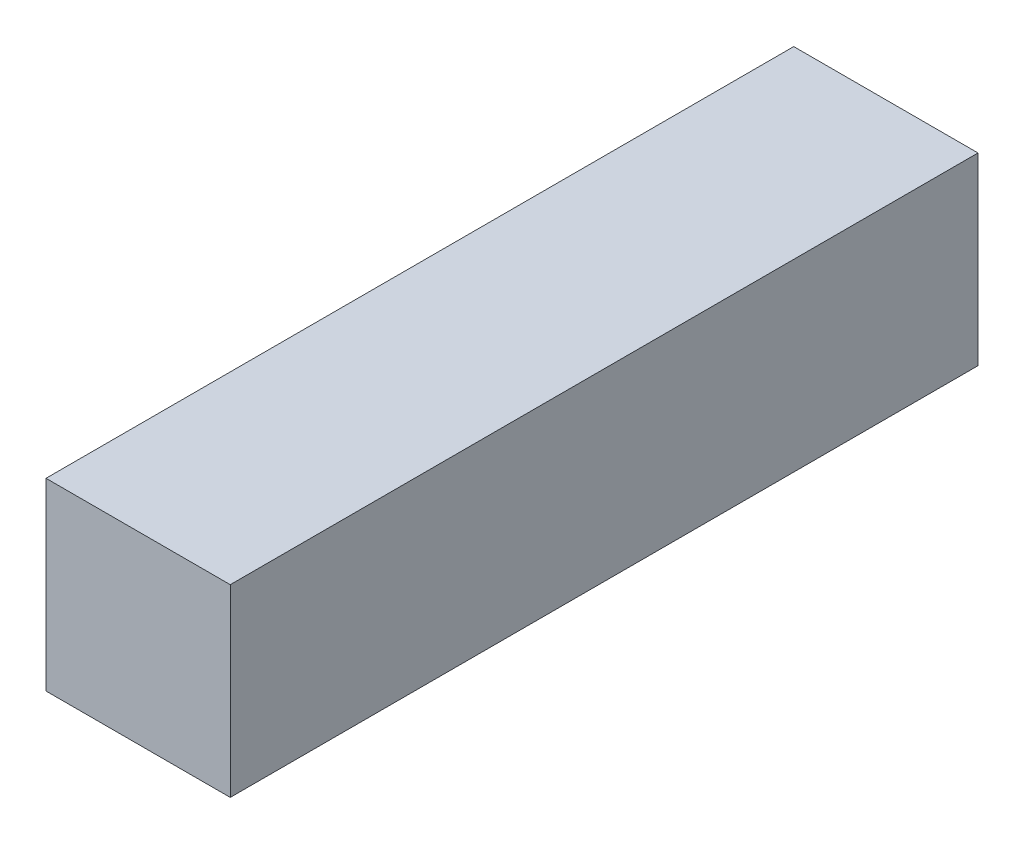
ISO-10303-21;
HEADER;
FILE_DESCRIPTION(('STEP AP214'),'2;1');
FILE_NAME('part.step','',(''),(''),'','','');
FILE_SCHEMA(('AUTOMOTIVE_DESIGN { 1 0 10303 214 1 1 1 1 }'));
ENDSEC;
DATA;
#1=APPLICATION_CONTEXT('core data for automotive mechanical design processes');
#2=APPLICATION_PROTOCOL_DEFINITION('international standard','automotive_design',2000,#1);
#3=PRODUCT_CONTEXT('',#1,'mechanical');
#4=PRODUCT('Part','Part','',(#3));
#5=PRODUCT_RELATED_PRODUCT_CATEGORY('part','',(#4));
#6=PRODUCT_DEFINITION_FORMATION('','',#4);
#7=PRODUCT_DEFINITION_CONTEXT('part definition',#1,'design');
#8=PRODUCT_DEFINITION('design','',#6,#7);
#9=PRODUCT_DEFINITION_SHAPE('','',#8);
#10=(LENGTH_UNIT() NAMED_UNIT(*) SI_UNIT(.MILLI.,.METRE.));
#11=(NAMED_UNIT(*) PLANE_ANGLE_UNIT() SI_UNIT($,.RADIAN.));
#12=(NAMED_UNIT(*) SI_UNIT($,.STERADIAN.) SOLID_ANGLE_UNIT());
#13=UNCERTAINTY_MEASURE_WITH_UNIT(LENGTH_MEASURE(1.E-05),#10,'distance_accuracy_value','');
#14=(GEOMETRIC_REPRESENTATION_CONTEXT(3) GLOBAL_UNCERTAINTY_ASSIGNED_CONTEXT((#13)) GLOBAL_UNIT_ASSIGNED_CONTEXT((#10,
#11,#12)) REPRESENTATION_CONTEXT('',''));
#15=CARTESIAN_POINT('',(0.,0.,0.));
#16=DIRECTION('',(0.,0.,1.));
#17=DIRECTION('',(1.,0.,0.));
#18=AXIS2_PLACEMENT_3D('',#15,#16,#17);
#19=CARTESIAN_POINT('',(6.35,-6.35,51.53914));
#20=DIRECTION('',(-1.,0.,0.));
#21=DIRECTION('',(0.,0.,1.));
#22=AXIS2_PLACEMENT_3D('',#19,#20,#21);
#23=PLANE('',#22);
#24=DIRECTION('',(0.,1.,0.));
#25=VECTOR('',#24,1.);
#26=CARTESIAN_POINT('',(6.35,-6.35,0.));
#27=LINE('',#26,#25);
#28=CARTESIAN_POINT('',(6.35,-6.35,0.));
#29=VERTEX_POINT('',#28);
#30=CARTESIAN_POINT('',(6.35,6.35,0.));
#31=VERTEX_POINT('',#30);
#32=EDGE_CURVE('E96',#29,#31,#27,.T.);
#33=ORIENTED_EDGE('',*,*,#32,.T.);
#34=DIRECTION('',(0.,0.,-1.));
#35=VECTOR('',#34,1.);
#36=CARTESIAN_POINT('',(6.35,6.35,51.53914));
#37=LINE('',#36,#35);
#38=CARTESIAN_POINT('',(6.35,6.35,51.53914));
#39=VERTEX_POINT('',#38);
#40=EDGE_CURVE('E11',#39,#31,#37,.T.);
#41=ORIENTED_EDGE('',*,*,#40,.F.);
#42=DIRECTION('',(0.,1.,0.));
#43=VECTOR('',#42,1.);
#44=CARTESIAN_POINT('',(6.35,-6.35,51.53914));
#45=LINE('',#44,#43);
#46=CARTESIAN_POINT('',(6.35,-6.35,51.53914));
#47=VERTEX_POINT('',#46);
#48=EDGE_CURVE('E84',#47,#39,#45,.T.);
#49=ORIENTED_EDGE('',*,*,#48,.F.);
#50=DIRECTION('',(0.,0.,-1.));
#51=VECTOR('',#50,1.);
#52=CARTESIAN_POINT('',(6.35,-6.35,51.53914));
#53=LINE('',#52,#51);
#54=EDGE_CURVE('E92',#47,#29,#53,.T.);
#55=ORIENTED_EDGE('',*,*,#54,.T.);
#56=EDGE_LOOP('',(#33,#41,#49,#55));
#57=FACE_BOUND('',#56,.T.);
#58=ADVANCED_FACE('F33',(#57),#23,.F.);
#59=CARTESIAN_POINT('',(-6.35,6.35,51.53914));
#60=DIRECTION('',(0.,-1.,0.));
#61=DIRECTION('',(0.,0.,-1.));
#62=AXIS2_PLACEMENT_3D('',#59,#60,#61);
#63=PLANE('',#62);
#64=DIRECTION('',(-1.,0.,0.));
#65=VECTOR('',#64,1.);
#66=CARTESIAN_POINT('',(-6.35,6.35,0.));
#67=LINE('',#66,#65);
#68=CARTESIAN_POINT('',(-6.35,6.35,0.));
#69=VERTEX_POINT('',#68);
#70=EDGE_CURVE('E88',#31,#69,#67,.T.);
#71=ORIENTED_EDGE('',*,*,#70,.T.);
#72=DIRECTION('',(0.,0.,-1.));
#73=VECTOR('',#72,1.);
#74=CARTESIAN_POINT('',(-6.35,6.35,51.53914));
#75=LINE('',#74,#73);
#76=CARTESIAN_POINT('',(-6.35,6.35,51.53914));
#77=VERTEX_POINT('',#76);
#78=EDGE_CURVE('E41',#77,#69,#75,.T.);
#79=ORIENTED_EDGE('',*,*,#78,.F.);
#80=DIRECTION('',(-1.,0.,0.));
#81=VECTOR('',#80,1.);
#82=CARTESIAN_POINT('',(-6.35,6.35,51.53914));
#83=LINE('',#82,#81);
#84=EDGE_CURVE('E79',#39,#77,#83,.T.);
#85=ORIENTED_EDGE('',*,*,#84,.F.);
#86=ORIENTED_EDGE('',*,*,#40,.T.);
#87=EDGE_LOOP('',(#71,#79,#85,#86));
#88=FACE_BOUND('',#87,.T.);
#89=ADVANCED_FACE('F87',(#88),#63,.F.);
#90=CARTESIAN_POINT('',(-6.35,-6.35,51.53914));
#91=DIRECTION('',(1.,0.,0.));
#92=DIRECTION('',(0.,0.,-1.));
#93=AXIS2_PLACEMENT_3D('',#90,#91,#92);
#94=PLANE('',#93);
#95=DIRECTION('',(0.,-1.,0.));
#96=VECTOR('',#95,1.);
#97=CARTESIAN_POINT('',(-6.35,-6.35,0.));
#98=LINE('',#97,#96);
#99=CARTESIAN_POINT('',(-6.35,-6.35,0.));
#100=VERTEX_POINT('',#99);
#101=EDGE_CURVE('E66',#69,#100,#98,.T.);
#102=ORIENTED_EDGE('',*,*,#101,.T.);
#103=DIRECTION('',(0.,0.,-1.));
#104=VECTOR('',#103,1.);
#105=CARTESIAN_POINT('',(-6.35,-6.35,51.53914));
#106=LINE('',#105,#104);
#107=CARTESIAN_POINT('',(-6.35,-6.35,51.53914));
#108=VERTEX_POINT('',#107);
#109=EDGE_CURVE('E89',#108,#100,#106,.T.);
#110=ORIENTED_EDGE('',*,*,#109,.F.);
#111=DIRECTION('',(0.,-1.,0.));
#112=VECTOR('',#111,1.);
#113=CARTESIAN_POINT('',(-6.35,-6.35,51.53914));
#114=LINE('',#113,#112);
#115=EDGE_CURVE('E82',#77,#108,#114,.T.);
#116=ORIENTED_EDGE('',*,*,#115,.F.);
#117=ORIENTED_EDGE('',*,*,#78,.T.);
#118=EDGE_LOOP('',(#102,#110,#116,#117));
#119=FACE_BOUND('',#118,.T.);
#120=ADVANCED_FACE('F90',(#119),#94,.F.);
#121=CARTESIAN_POINT('',(-6.35,-6.35,51.53914));
#122=DIRECTION('',(0.,1.,0.));
#123=DIRECTION('',(0.,0.,1.));
#124=AXIS2_PLACEMENT_3D('',#121,#122,#123);
#125=PLANE('',#124);
#126=DIRECTION('',(1.,0.,0.));
#127=VECTOR('',#126,1.);
#128=CARTESIAN_POINT('',(-6.35,-6.35,0.));
#129=LINE('',#128,#127);
#130=EDGE_CURVE('E72',#100,#29,#129,.T.);
#131=ORIENTED_EDGE('',*,*,#130,.T.);
#132=ORIENTED_EDGE('',*,*,#54,.F.);
#133=DIRECTION('',(1.,0.,0.));
#134=VECTOR('',#133,1.);
#135=CARTESIAN_POINT('',(-6.35,-6.35,51.53914));
#136=LINE('',#135,#134);
#137=EDGE_CURVE('E49',#108,#47,#136,.T.);
#138=ORIENTED_EDGE('',*,*,#137,.F.);
#139=ORIENTED_EDGE('',*,*,#109,.T.);
#140=EDGE_LOOP('',(#131,#132,#138,#139));
#141=FACE_BOUND('',#140,.T.);
#142=ADVANCED_FACE('F103',(#141),#125,.F.);
#143=CARTESIAN_POINT('',(0.,0.,51.53914));
#144=DIRECTION('',(0.,0.,-1.));
#145=DIRECTION('',(-1.,0.,0.));
#146=AXIS2_PLACEMENT_3D('',#143,#144,#145);
#147=PLANE('',#146);
#148=ORIENTED_EDGE('',*,*,#48,.T.);
#149=ORIENTED_EDGE('',*,*,#84,.T.);
#150=ORIENTED_EDGE('',*,*,#115,.T.);
#151=ORIENTED_EDGE('',*,*,#137,.T.);
#152=EDGE_LOOP('',(#148,#149,#150,#151));
#153=FACE_BOUND('',#152,.T.);
#154=ADVANCED_FACE('F80',(#153),#147,.F.);
#155=CARTESIAN_POINT('',(0.,0.,0.));
#156=DIRECTION('',(0.,0.,-1.));
#157=DIRECTION('',(-1.,0.,0.));
#158=AXIS2_PLACEMENT_3D('',#155,#156,#157);
#159=PLANE('',#158);
#160=ORIENTED_EDGE('',*,*,#32,.F.);
#161=ORIENTED_EDGE('',*,*,#130,.F.);
#162=ORIENTED_EDGE('',*,*,#101,.F.);
#163=ORIENTED_EDGE('',*,*,#70,.F.);
#164=EDGE_LOOP('',(#160,#161,#162,#163));
#165=FACE_BOUND('',#164,.T.);
#166=ADVANCED_FACE('F106',(#165),#159,.T.);
#167=CLOSED_SHELL('',(#58,#89,#120,#142,#154,#166));
#168=MANIFOLD_SOLID_BREP('B2',#167);
#169=ADVANCED_BREP_SHAPE_REPRESENTATION('',(#18,#168),#14);
#170=SHAPE_DEFINITION_REPRESENTATION(#9,#169);
ENDSEC;
END-ISO-10303-21;
